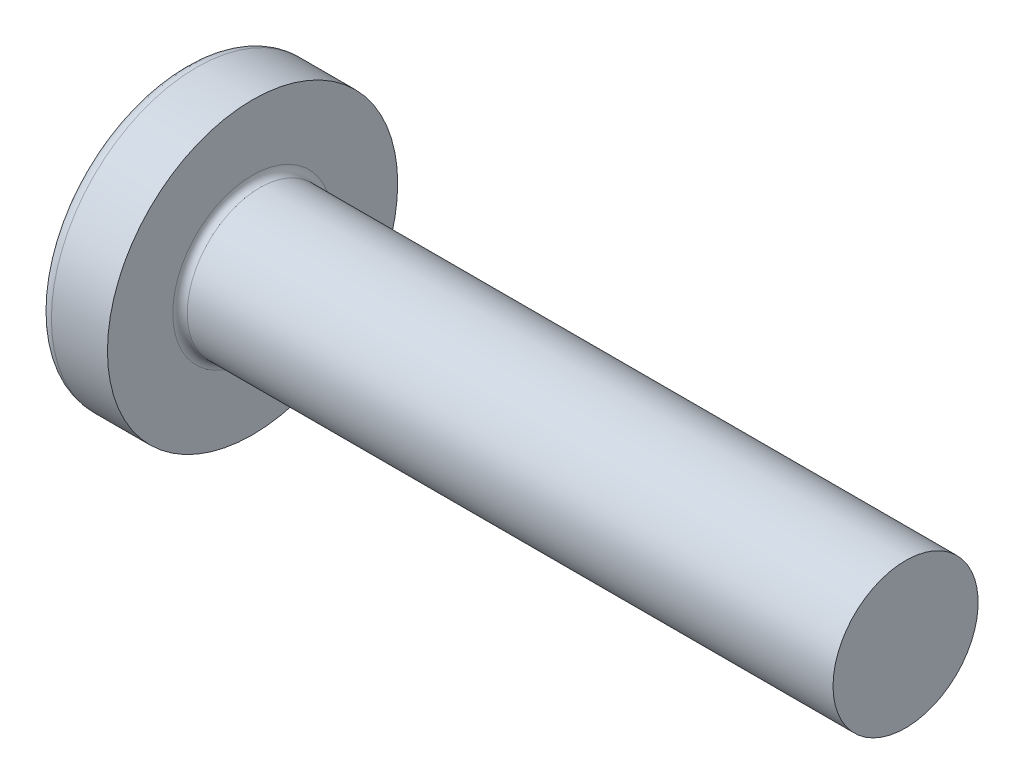
ISO-10303-21;
HEADER;
FILE_DESCRIPTION(('STEP AP214'),'2;1');
FILE_NAME('part.step','',(''),(''),'','','');
FILE_SCHEMA(('AUTOMOTIVE_DESIGN { 1 0 10303 214 1 1 1 1 }'));
ENDSEC;
DATA;
#1=APPLICATION_CONTEXT('core data for automotive mechanical design processes');
#2=APPLICATION_PROTOCOL_DEFINITION('international standard','automotive_design',2000,#1);
#3=PRODUCT_CONTEXT('',#1,'mechanical');
#4=PRODUCT('Part','Part','',(#3));
#5=PRODUCT_RELATED_PRODUCT_CATEGORY('part','',(#4));
#6=PRODUCT_DEFINITION_FORMATION('','',#4);
#7=PRODUCT_DEFINITION_CONTEXT('part definition',#1,'design');
#8=PRODUCT_DEFINITION('design','',#6,#7);
#9=PRODUCT_DEFINITION_SHAPE('','',#8);
#10=(LENGTH_UNIT() NAMED_UNIT(*) SI_UNIT(.MILLI.,.METRE.));
#11=(NAMED_UNIT(*) PLANE_ANGLE_UNIT() SI_UNIT($,.RADIAN.));
#12=(NAMED_UNIT(*) SI_UNIT($,.STERADIAN.) SOLID_ANGLE_UNIT());
#13=UNCERTAINTY_MEASURE_WITH_UNIT(LENGTH_MEASURE(1.E-05),#10,'distance_accuracy_value','');
#14=(GEOMETRIC_REPRESENTATION_CONTEXT(3) GLOBAL_UNCERTAINTY_ASSIGNED_CONTEXT((#13)) GLOBAL_UNIT_ASSIGNED_CONTEXT((#10,
#11,#12)) REPRESENTATION_CONTEXT('',''));
#15=CARTESIAN_POINT('',(0.,0.,0.));
#16=DIRECTION('',(0.,0.,1.));
#17=DIRECTION('',(1.,0.,0.));
#18=AXIS2_PLACEMENT_3D('',#15,#16,#17);
#19=CARTESIAN_POINT('',(0.,-2.15,-0.515));
#20=DIRECTION('',(0.446197753347436,-0.894934391398443,0.));
#21=DIRECTION('',(0.894934391398443,0.446197753347436,0.));
#22=AXIS2_PLACEMENT_3D('',#19,#20,#21);
#23=PLANE('',#22);
#24=DIRECTION('',(0.,0.,1.));
#25=VECTOR('',#24,1.);
#26=CARTESIAN_POINT('',(2.34,-0.983319232260743,-0.515));
#27=LINE('',#26,#25);
#28=CARTESIAN_POINT('',(2.34,-0.983319232260742,-0.515));
#29=VERTEX_POINT('',#28);
#30=CARTESIAN_POINT('',(2.34,-0.983319232260743,0.515));
#31=VERTEX_POINT('',#30);
#32=EDGE_CURVE('E150',#29,#31,#27,.T.);
#33=ORIENTED_EDGE('',*,*,#32,.F.);
#34=DIRECTION('',(0.894934391398443,0.446197753347436,0.));
#35=VECTOR('',#34,1.);
#36=CARTESIAN_POINT('',(0.331830520157853,-1.98455543332603,-0.515));
#37=LINE('',#36,#35);
#38=CARTESIAN_POINT('',(0.331830520157854,-1.98455543332603,-0.515));
#39=VERTEX_POINT('',#38);
#40=EDGE_CURVE('E154',#39,#29,#37,.T.);
#41=ORIENTED_EDGE('',*,*,#40,.F.);
#42=CARTESIAN_POINT('',(0.331830520157854,-1.98455543332603,0.514999999999998));
#43=CARTESIAN_POINT('',(0.319498798424873,-1.99070380194952,0.343333333333332));
#44=CARTESIAN_POINT('',(0.313332937558384,-1.99377798626127,0.171666666666665));
#45=CARTESIAN_POINT('',(0.313332937558389,-1.99377798626128,-0.171666666666671));
#46=CARTESIAN_POINT('',(0.319498798424884,-1.99070380194955,-0.343333333333342));
#47=CARTESIAN_POINT('',(0.331830520157871,-1.98455543332607,-0.515000000000013));
#48=B_SPLINE_CURVE_WITH_KNOTS('',3,(#42,#43,#44,#45,#46,#47),.UNSPECIFIED.,.F.,.F.,(4,2,4),(0.,
0.515414605967532,1.03082921193508),.UNSPECIFIED.);
#49=CARTESIAN_POINT('',(0.331830520157854,-1.98455543332603,0.515));
#50=VERTEX_POINT('',#49);
#51=EDGE_CURVE('E139',#50,#39,#48,.T.);
#52=ORIENTED_EDGE('',*,*,#51,.F.);
#53=DIRECTION('',(-0.894934391398443,-0.446197753347436,0.));
#54=VECTOR('',#53,1.);
#55=CARTESIAN_POINT('',(2.34,-0.983319232260743,0.515));
#56=LINE('',#55,#54);
#57=EDGE_CURVE('E164',#31,#50,#56,.T.);
#58=ORIENTED_EDGE('',*,*,#57,.F.);
#59=EDGE_LOOP('',(#33,#41,#52,#58));
#60=FACE_BOUND('',#59,.T.);
#61=ADVANCED_FACE('F17',(#60),#23,.F.);
#62=CARTESIAN_POINT('',(0.,-2.15,0.514999999999999));
#63=DIRECTION('',(0.,0.,-1.));
#64=DIRECTION('',(-1.,0.,0.));
#65=AXIS2_PLACEMENT_3D('',#62,#63,#64);
#66=PLANE('',#65);
#67=DIRECTION('',(0.,1.,0.));
#68=VECTOR('',#67,1.);
#69=CARTESIAN_POINT('',(2.34,-2.15,0.515));
#70=LINE('',#69,#68);
#71=CARTESIAN_POINT('',(2.34000000000175,-0.677477674907183,0.51499999999998));
#72=VERTEX_POINT('',#71);
#73=EDGE_CURVE('E305',#72,#31,#70,.F.);
#74=ORIENTED_EDGE('',*,*,#73,.T.);
#75=ORIENTED_EDGE('',*,*,#57,.T.);
#76=CARTESIAN_POINT('',(0.331830520157854,-1.98455543332603,0.515000000000001));
#77=CARTESIAN_POINT('',(0.273182530445949,-1.80216454181507,0.515000000000023));
#78=CARTESIAN_POINT('',(0.222773490743651,-1.61790695532938,0.515000000000022));
#79=CARTESIAN_POINT('',(0.138433311358271,-1.24565839240852,0.514999999999977));
#80=CARTESIAN_POINT('',(0.104502171675189,-1.05766741597335,0.514999999999933));
#81=CARTESIAN_POINT('',(0.0788099820017152,-0.867809744563443,0.514999999999866));
#82=B_SPLINE_CURVE_WITH_KNOTS('',3,(#76,#77,#78,#79,#80,#81),.UNSPECIFIED.,.F.,.F.,(4,2,4),(0.,
0.573085827037425,1.14617165407485),.UNSPECIFIED.);
#83=CARTESIAN_POINT('',(0.0788099820150379,-0.867809744561917,0.514999999999933));
#84=VERTEX_POINT('',#83);
#85=EDGE_CURVE('E146',#50,#84,#82,.T.);
#86=ORIENTED_EDGE('',*,*,#85,.T.);
#87=CARTESIAN_POINT('',(0.0788099820105211,-0.867809744561843,0.514999999999999));
#88=CARTESIAN_POINT('',(0.392213734002262,-0.842304642325876,0.514999999999999));
#89=CARTESIAN_POINT('',(0.70559787355606,-0.816547301111019,0.515));
#90=CARTESIAN_POINT('',(1.33229966547313,-0.76425626320608,0.515));
#91=CARTESIAN_POINT('',(1.64561731816469,-0.737722570443666,0.515));
#92=CARTESIAN_POINT('',(2.08593418824368,-0.69969155696372,0.515));
#93=CARTESIAN_POINT('',(2.21297124645575,-0.68863226058366,0.515));
#94=CARTESIAN_POINT('',(2.34000000000109,-0.677477674906791,0.515));
#95=B_SPLINE_CURVE_WITH_KNOTS('',3,(#87,#88,#89,#90,#91,#92,#93,#94),.UNSPECIFIED.,.F.,.F.,(4,2,
2,4),(0.,0.943320959581089,1.88663714759769,2.26918969179948),.UNSPECIFIED.);
#96=EDGE_CURVE('E156',#84,#72,#95,.T.);
#97=ORIENTED_EDGE('',*,*,#96,.T.);
#98=EDGE_LOOP('',(#74,#75,#86,#97));
#99=FACE_BOUND('',#98,.T.);
#100=ADVANCED_FACE('F458',(#99),#66,.T.);
#101=CARTESIAN_POINT('',(0.,2.15,-0.515));
#102=DIRECTION('',(0.,0.,1.));
#103=DIRECTION('',(1.,0.,0.));
#104=AXIS2_PLACEMENT_3D('',#101,#102,#103);
#105=PLANE('',#104);
#106=CARTESIAN_POINT('',(0.0788099820017082,-0.867809744563347,-0.515000000000002));
#107=CARTESIAN_POINT('',(0.104502171675179,-1.05766741597327,-0.515000000000001));
#108=CARTESIAN_POINT('',(0.138433311358259,-1.24565839240845,-0.515));
#109=CARTESIAN_POINT('',(0.222773490743641,-1.61790695532935,-0.515));
#110=CARTESIAN_POINT('',(0.273182530445943,-1.80216454181506,-0.514999999999999));
#111=CARTESIAN_POINT('',(0.331830520157854,-1.98455543332603,-0.514999999999999));
#112=B_SPLINE_CURVE_WITH_KNOTS('',3,(#106,#107,#108,#109,#110,#111),.UNSPECIFIED.,.F.,.F.,(4,2,
4),(0.,0.573085827037473,1.14617165407495),.UNSPECIFIED.);
#113=CARTESIAN_POINT('',(0.0788099820061147,-0.867809744562595,-0.515000000000001));
#114=VERTEX_POINT('',#113);
#115=EDGE_CURVE('E143',#114,#39,#112,.T.);
#116=ORIENTED_EDGE('',*,*,#115,.T.);
#117=ORIENTED_EDGE('',*,*,#40,.T.);
#118=DIRECTION('',(0.,1.,0.));
#119=VECTOR('',#118,1.);
#120=CARTESIAN_POINT('',(2.34,2.15,-0.515));
#121=LINE('',#120,#119);
#122=CARTESIAN_POINT('',(2.34000000000175,-0.677477674907168,-0.515));
#123=VERTEX_POINT('',#122);
#124=EDGE_CURVE('E162',#29,#123,#121,.T.);
#125=ORIENTED_EDGE('',*,*,#124,.T.);
#126=CARTESIAN_POINT('',(2.34000000000109,-0.677477674906791,-0.515));
#127=CARTESIAN_POINT('',(2.07584465982531,-0.700667758110798,-0.515));
#128=CARTESIAN_POINT('',(1.81165398196259,-0.723450497756089,-0.515));
#129=CARTESIAN_POINT('',(1.28321771173505,-0.768360358266413,-0.515));
#130=CARTESIAN_POINT('',(1.01897211955267,-0.79048748127564,-0.515));
#131=CARTESIAN_POINT('',(0.642063816057716,-0.821692201389346,-0.515));
#132=CARTESIAN_POINT('',(0.529417831854457,-0.830972904506625,-0.515));
#133=CARTESIAN_POINT('',(0.304118917866834,-0.849451547308498,-0.515));
#134=CARTESIAN_POINT('',(0.191465988073096,-0.858649486878829,-0.515));
#135=CARTESIAN_POINT('',(0.078809982010521,-0.867809744561842,-0.515));
#136=B_SPLINE_CURVE_WITH_KNOTS('',3,(#126,#127,#128,#129,#130,#131,#132,#133,#134,#135),
.UNSPECIFIED.,.F.,.F.,(4,2,2,2,4),(0.,0.795513032095966,1.59102346217911,1.93010639275618,
2.26918979140427),.UNSPECIFIED.);
#137=EDGE_CURVE('E160',#123,#114,#136,.T.);
#138=ORIENTED_EDGE('',*,*,#137,.T.);
#139=EDGE_LOOP('',(#116,#117,#125,#138));
#140=FACE_BOUND('',#139,.T.);
#141=ADVANCED_FACE('F158',(#140),#105,.T.);
#142=CARTESIAN_POINT('',(0.0788099821420474,0.,0.));
#143=DIRECTION('',(-1.,0.,0.));
#144=DIRECTION('',(0.,0.,1.));
#145=AXIS2_PLACEMENT_3D('',#142,#143,#144);
#146=CONICAL_SURFACE('',#145,1.00911780914714,0.0698131700804186);
#147=CARTESIAN_POINT('',(2.34000000000043,-0.515000000000002,0.677477674906847));
#148=CARTESIAN_POINT('',(2.07584465982464,-0.515000000000003,0.700667758110854));
#149=CARTESIAN_POINT('',(1.81165398196191,-0.515000000000003,0.723450497756147));
#150=CARTESIAN_POINT('',(1.28321771173434,-0.515000000000003,0.768360358266472));
#151=CARTESIAN_POINT('',(1.01897211955194,-0.515000000000002,0.790487481275699));
#152=CARTESIAN_POINT('',(0.642063816056353,-0.515000000000003,0.821692201389457));
#153=CARTESIAN_POINT('',(0.529417831852476,-0.515000000000003,0.830972904506786));
#154=CARTESIAN_POINT('',(0.304118917863614,-0.515000000000003,0.84945154730876));
#155=CARTESIAN_POINT('',(0.191465988069257,-0.515000000000003,0.85864948687914));
#156=CARTESIAN_POINT('',(0.0788099820060616,-0.515000000000003,0.867809744562203));
#157=B_SPLINE_CURVE_WITH_KNOTS('',3,(#147,#148,#149,#150,#151,#152,#153,#154,#155,#156),
.UNSPECIFIED.,.F.,.F.,(4,2,2,2,4),(0.,0.795513032096009,1.5910234621792,1.93010639275813,
2.26918979140808),.UNSPECIFIED.);
#158=CARTESIAN_POINT('',(2.34000000000175,-0.515000000000003,0.677477674907166));
#159=VERTEX_POINT('',#158);
#160=CARTESIAN_POINT('',(0.0788099820150116,-0.515000000000002,0.867809744611743));
#161=VERTEX_POINT('',#160);
#162=EDGE_CURVE('E289',#159,#161,#157,.T.);
#163=ORIENTED_EDGE('',*,*,#162,.F.);
#164=CARTESIAN_POINT('',(2.34000000000378,0.,0.));
#165=DIRECTION('',(-1.,0.,0.));
#166=DIRECTION('',(0.,0.,1.));
#167=AXIS2_PLACEMENT_3D('',#164,#165,#166);
#168=CIRCLE('',#167,0.850999999997271);
#169=EDGE_CURVE('E296',#72,#159,#168,.T.);
#170=ORIENTED_EDGE('',*,*,#169,.F.);
#171=ORIENTED_EDGE('',*,*,#96,.F.);
#172=CARTESIAN_POINT('',(0.0788099820283605,0.,0.));
#173=DIRECTION('',(-1.,0.,0.));
#174=DIRECTION('',(0.,0.,1.));
#175=AXIS2_PLACEMENT_3D('',#172,#173,#174);
#176=CIRCLE('',#175,1.00911780915509);
#177=EDGE_CURVE('E298',#161,#84,#176,.F.);
#178=ORIENTED_EDGE('',*,*,#177,.F.);
#179=EDGE_LOOP('',(#163,#170,#171,#178));
#180=FACE_BOUND('',#179,.T.);
#181=ADVANCED_FACE('F447',(#180),#146,.F.);
#182=CARTESIAN_POINT('',(0.0788099821420474,0.,0.));
#183=DIRECTION('',(-1.,0.,0.));
#184=DIRECTION('',(0.,0.,1.));
#185=AXIS2_PLACEMENT_3D('',#182,#183,#184);
#186=CONICAL_SURFACE('',#185,1.00911780914714,0.0698131700804186);
#187=CARTESIAN_POINT('',(0.0788099820060611,-0.514999999999996,-0.867809744562207));
#188=CARTESIAN_POINT('',(0.392213733997899,-0.514999999999996,-0.842304642326235));
#189=CARTESIAN_POINT('',(0.705597873551794,-0.514999999999997,-0.816547301111373));
#190=CARTESIAN_POINT('',(1.33229966546905,-0.514999999999997,-0.764256263206425));
#191=CARTESIAN_POINT('',(1.64561731816071,-0.514999999999997,-0.737722570444007));
#192=CARTESIAN_POINT('',(2.08593418824088,-0.514999999999997,-0.699691556963965));
#193=CARTESIAN_POINT('',(2.21297124645402,-0.514999999999997,-0.688632260583813));
#194=CARTESIAN_POINT('',(2.34000000000043,-0.514999999999998,-0.677477674906851));
#195=B_SPLINE_CURVE_WITH_KNOTS('',3,(#187,#188,#189,#190,#191,#192,#193,#194),.UNSPECIFIED.,.F.,
.F.,(4,2,2,4),(0.,0.94332095958138,1.88663714759827,2.2691896918033),.UNSPECIFIED.);
#196=CARTESIAN_POINT('',(0.0788099820172106,-0.514999999999994,-0.867809744611342));
#197=VERTEX_POINT('',#196);
#198=CARTESIAN_POINT('',(2.34000000000175,-0.514999999999998,-0.67747767490717));
#199=VERTEX_POINT('',#198);
#200=EDGE_CURVE('E283',#197,#199,#195,.T.);
#201=ORIENTED_EDGE('',*,*,#200,.F.);
#202=CARTESIAN_POINT('',(0.0788099820283605,0.,0.));
#203=DIRECTION('',(-1.,0.,0.));
#204=DIRECTION('',(0.,0.,1.));
#205=AXIS2_PLACEMENT_3D('',#202,#203,#204);
#206=CIRCLE('',#205,1.00911780915509);
#207=EDGE_CURVE('E295',#114,#197,#206,.F.);
#208=ORIENTED_EDGE('',*,*,#207,.F.);
#209=ORIENTED_EDGE('',*,*,#137,.F.);
#210=CARTESIAN_POINT('',(2.34000000000378,0.,0.));
#211=DIRECTION('',(-1.,0.,0.));
#212=DIRECTION('',(0.,0.,1.));
#213=AXIS2_PLACEMENT_3D('',#210,#211,#212);
#214=CIRCLE('',#213,0.850999999997271);
#215=EDGE_CURVE('E290',#199,#123,#214,.T.);
#216=ORIENTED_EDGE('',*,*,#215,.F.);
#217=EDGE_LOOP('',(#201,#208,#209,#216));
#218=FACE_BOUND('',#217,.T.);
#219=ADVANCED_FACE('F435',(#218),#186,.F.);
#220=CARTESIAN_POINT('',(0.,-0.514999999999992,-2.15));
#221=DIRECTION('',(0.,1.,0.));
#222=DIRECTION('',(0.,0.,1.));
#223=AXIS2_PLACEMENT_3D('',#220,#221,#222);
#224=PLANE('',#223);
#225=CARTESIAN_POINT('',(6.5,-0.515000000000002,0.));
#226=DIRECTION('',(0.,1.,0.));
#227=DIRECTION('',(0.,0.,1.));
#228=AXIS2_PLACEMENT_3D('',#225,#226,#227);
#229=CIRCLE('',#228,6.47956595768575);
#230=CARTESIAN_POINT('',(0.331830520157854,-0.515000000000004,1.98455543332603));
#231=VERTEX_POINT('',#230);
#232=EDGE_CURVE('E445',#161,#231,#229,.T.);
#233=ORIENTED_EDGE('',*,*,#232,.T.);
#234=DIRECTION('',(0.894934391398443,0.,-0.446197753347436));
#235=VECTOR('',#234,1.);
#236=CARTESIAN_POINT('',(2.34,-0.515000000000007,0.983319232260741));
#237=LINE('',#236,#235);
#238=CARTESIAN_POINT('',(2.34,-0.515000000000006,0.983319232260741));
#239=VERTEX_POINT('',#238);
#240=EDGE_CURVE('E271',#231,#239,#237,.T.);
#241=ORIENTED_EDGE('',*,*,#240,.T.);
#242=DIRECTION('',(0.,0.,1.));
#243=VECTOR('',#242,1.);
#244=CARTESIAN_POINT('',(2.34,-0.514999999999992,-2.15));
#245=LINE('',#244,#243);
#246=EDGE_CURVE('E286',#239,#159,#245,.F.);
#247=ORIENTED_EDGE('',*,*,#246,.T.);
#248=ORIENTED_EDGE('',*,*,#162,.T.);
#249=EDGE_LOOP('',(#233,#241,#247,#248));
#250=FACE_BOUND('',#249,.T.);
#251=ADVANCED_FACE('F431',(#250),#224,.T.);
#252=CARTESIAN_POINT('',(0.,-0.514999999999992,-2.15));
#253=DIRECTION('',(0.,1.,0.));
#254=DIRECTION('',(0.,0.,1.));
#255=AXIS2_PLACEMENT_3D('',#252,#253,#254);
#256=PLANE('',#255);
#257=DIRECTION('',(0.,0.,1.));
#258=VECTOR('',#257,1.);
#259=CARTESIAN_POINT('',(2.34,-0.514999999999992,-2.15));
#260=LINE('',#259,#258);
#261=CARTESIAN_POINT('',(2.34,-0.514999999999996,-0.983319232260743));
#262=VERTEX_POINT('',#261);
#263=EDGE_CURVE('E281',#199,#262,#260,.F.);
#264=ORIENTED_EDGE('',*,*,#263,.T.);
#265=DIRECTION('',(-0.894934391398443,0.,-0.446197753347436));
#266=VECTOR('',#265,1.);
#267=CARTESIAN_POINT('',(0.,-0.514999999999996,-2.15));
#268=LINE('',#267,#266);
#269=CARTESIAN_POINT('',(0.331830520157854,-0.514999999999992,-1.98455543332603));
#270=VERTEX_POINT('',#269);
#271=EDGE_CURVE('E261',#262,#270,#268,.T.);
#272=ORIENTED_EDGE('',*,*,#271,.T.);
#273=CARTESIAN_POINT('',(6.5,-0.514999999999992,0.));
#274=DIRECTION('',(0.,1.,0.));
#275=DIRECTION('',(0.,0.,1.));
#276=AXIS2_PLACEMENT_3D('',#273,#274,#275);
#277=CIRCLE('',#276,6.47956595768575);
#278=EDGE_CURVE('E708',#270,#197,#277,.T.);
#279=ORIENTED_EDGE('',*,*,#278,.T.);
#280=ORIENTED_EDGE('',*,*,#200,.T.);
#281=EDGE_LOOP('',(#264,#272,#279,#280));
#282=FACE_BOUND('',#281,.T.);
#283=ADVANCED_FACE('F426',(#282),#256,.T.);
#284=CARTESIAN_POINT('',(2.34,-0.515000000000004,0.983319232260741));
#285=DIRECTION('',(0.446197753347436,0.,0.894934391398443));
#286=DIRECTION('',(0.894934391398443,0.,-0.446197753347436));
#287=AXIS2_PLACEMENT_3D('',#284,#285,#286);
#288=PLANE('',#287);
#289=DIRECTION('',(0.,1.,0.));
#290=VECTOR('',#289,1.);
#291=CARTESIAN_POINT('',(2.34,-0.515000000000004,0.983319232260741));
#292=LINE('',#291,#290);
#293=CARTESIAN_POINT('',(2.34,0.514999999999997,0.983319232260743));
#294=VERTEX_POINT('',#293);
#295=EDGE_CURVE('E274',#239,#294,#292,.T.);
#296=ORIENTED_EDGE('',*,*,#295,.F.);
#297=ORIENTED_EDGE('',*,*,#240,.F.);
#298=CARTESIAN_POINT('',(0.331830520157854,0.514999999999994,1.98455543332603));
#299=CARTESIAN_POINT('',(0.319498798424876,0.343333333333328,1.99070380194953));
#300=CARTESIAN_POINT('',(0.313332937558386,0.171666666666661,1.99377798626128));
#301=CARTESIAN_POINT('',(0.313332937558386,-0.171666666666673,1.99377798626127));
#302=CARTESIAN_POINT('',(0.319498798424876,-0.34333333333334,1.99070380194953));
#303=CARTESIAN_POINT('',(0.331830520157854,-0.515000000000006,1.98455543332603));
#304=B_SPLINE_CURVE_WITH_KNOTS('',3,(#298,#299,#300,#301,#302,#303),.UNSPECIFIED.,.F.,.F.,(4,2,
4),(0.,0.515414605967534,1.03082921193507),.UNSPECIFIED.);
#305=CARTESIAN_POINT('',(0.331830520157854,0.514999999999988,1.98455543332604));
#306=VERTEX_POINT('',#305);
#307=EDGE_CURVE('E275',#306,#231,#304,.T.);
#308=ORIENTED_EDGE('',*,*,#307,.F.);
#309=DIRECTION('',(-0.894934391398443,0.,0.446197753347436));
#310=VECTOR('',#309,1.);
#311=CARTESIAN_POINT('',(2.34,0.514999999999997,0.983319232260744));
#312=LINE('',#311,#310);
#313=EDGE_CURVE('E255',#294,#306,#312,.T.);
#314=ORIENTED_EDGE('',*,*,#313,.F.);
#315=EDGE_LOOP('',(#296,#297,#308,#314));
#316=FACE_BOUND('',#315,.T.);
#317=ADVANCED_FACE('F423',(#316),#288,.F.);
#318=CARTESIAN_POINT('',(2.34,0.983319232260742,-0.515));
#319=DIRECTION('',(-1.,0.,0.));
#320=DIRECTION('',(0.,0.,1.));
#321=AXIS2_PLACEMENT_3D('',#318,#319,#320);
#322=PLANE('',#321);
#323=ORIENTED_EDGE('',*,*,#124,.F.);
#324=ORIENTED_EDGE('',*,*,#32,.T.);
#325=ORIENTED_EDGE('',*,*,#73,.F.);
#326=CARTESIAN_POINT('',(2.33999999999972,0.,0.));
#327=DIRECTION('',(-1.,0.,0.));
#328=DIRECTION('',(0.,0.,1.));
#329=AXIS2_PLACEMENT_3D('',#326,#327,#328);
#330=CIRCLE('',#329,0.850999999999935);
#331=EDGE_CURVE('E246',#72,#123,#330,.F.);
#332=ORIENTED_EDGE('',*,*,#331,.T.);
#333=EDGE_LOOP('',(#323,#324,#325,#332));
#334=FACE_BOUND('',#333,.T.);
#335=ADVANCED_FACE('F403',(#334),#322,.T.);
#336=CARTESIAN_POINT('',(0.,0.515000000000008,-2.15));
#337=DIRECTION('',(0.446197753347436,0.,-0.894934391398443));
#338=DIRECTION('',(-0.894934391398443,0.,-0.446197753347436));
#339=AXIS2_PLACEMENT_3D('',#336,#337,#338);
#340=PLANE('',#339);
#341=DIRECTION('',(0.,1.,0.));
#342=VECTOR('',#341,1.);
#343=CARTESIAN_POINT('',(2.34,0.983319232260742,-0.983319232260741));
#344=LINE('',#343,#342);
#345=CARTESIAN_POINT('',(2.34,0.515000000000003,-0.98331923226074));
#346=VERTEX_POINT('',#345);
#347=EDGE_CURVE('E252',#346,#262,#344,.F.);
#348=ORIENTED_EDGE('',*,*,#347,.F.);
#349=DIRECTION('',(0.894934391398443,0.,0.446197753347436));
#350=VECTOR('',#349,1.);
#351=CARTESIAN_POINT('',(0.331830520157856,0.515000000000007,-1.98455543332603));
#352=LINE('',#351,#350);
#353=CARTESIAN_POINT('',(0.331830520157855,0.51500000000001,-1.98455543332603));
#354=VERTEX_POINT('',#353);
#355=EDGE_CURVE('E236',#354,#346,#352,.T.);
#356=ORIENTED_EDGE('',*,*,#355,.F.);
#357=CARTESIAN_POINT('',(0.331830520157855,-0.514999999999994,-1.98455543332604));
#358=CARTESIAN_POINT('',(0.319498798424876,-0.343333333333327,-1.99070380194953));
#359=CARTESIAN_POINT('',(0.313332937558386,-0.17166666666666,-1.99377798626128));
#360=CARTESIAN_POINT('',(0.313332937558387,0.171666666666674,-1.99377798626127));
#361=CARTESIAN_POINT('',(0.319498798424876,0.343333333333341,-1.99070380194953));
#362=CARTESIAN_POINT('',(0.331830520157856,0.515000000000007,-1.98455543332603));
#363=B_SPLINE_CURVE_WITH_KNOTS('',3,(#357,#358,#359,#360,#361,#362),.UNSPECIFIED.,.F.,.F.,(4,2,
4),(0.,0.515414605967534,1.03082921193507),.UNSPECIFIED.);
#364=EDGE_CURVE('E264',#270,#354,#363,.T.);
#365=ORIENTED_EDGE('',*,*,#364,.F.);
#366=ORIENTED_EDGE('',*,*,#271,.F.);
#367=EDGE_LOOP('',(#348,#356,#365,#366));
#368=FACE_BOUND('',#367,.T.);
#369=ADVANCED_FACE('F398',(#368),#340,.F.);
#370=CARTESIAN_POINT('',(0.,0.514999999999993,2.15));
#371=DIRECTION('',(0.,-1.,0.));
#372=DIRECTION('',(0.,0.,-1.));
#373=AXIS2_PLACEMENT_3D('',#370,#371,#372);
#374=PLANE('',#373);
#375=DIRECTION('',(0.,0.,1.));
#376=VECTOR('',#375,1.);
#377=CARTESIAN_POINT('',(2.34,0.514999999999997,-0.515));
#378=LINE('',#377,#376);
#379=CARTESIAN_POINT('',(2.34000000000009,0.514999999999978,0.677477674907863));
#380=VERTEX_POINT('',#379);
#381=EDGE_CURVE('E249',#294,#380,#378,.F.);
#382=ORIENTED_EDGE('',*,*,#381,.F.);
#383=ORIENTED_EDGE('',*,*,#313,.T.);
#384=CARTESIAN_POINT('',(6.5,0.514999999999993,0.));
#385=DIRECTION('',(0.,1.,0.));
#386=DIRECTION('',(0.,0.,1.));
#387=AXIS2_PLACEMENT_3D('',#384,#385,#386);
#388=CIRCLE('',#387,6.47956595768575);
#389=CARTESIAN_POINT('',(0.0788099820150342,0.514999999999993,0.867809744611911));
#390=VERTEX_POINT('',#389);
#391=EDGE_CURVE('E258',#306,#390,#388,.F.);
#392=ORIENTED_EDGE('',*,*,#391,.T.);
#393=CARTESIAN_POINT('',(0.0788099820105218,0.514999999999997,0.867809744561844));
#394=CARTESIAN_POINT('',(0.392213734002263,0.514999999999997,0.842304642325877));
#395=CARTESIAN_POINT('',(0.705597873556061,0.514999999999997,0.81654730111102));
#396=CARTESIAN_POINT('',(1.33229966547313,0.514999999999997,0.764256263206081));
#397=CARTESIAN_POINT('',(1.64561731816469,0.514999999999998,0.737722570443667));
#398=CARTESIAN_POINT('',(2.08593418824345,0.514999999999998,0.699691556963741));
#399=CARTESIAN_POINT('',(2.21297124645529,0.514999999999998,0.688632260583701));
#400=CARTESIAN_POINT('',(2.3400000000004,0.514999999999998,0.677477674906854));
#401=B_SPLINE_CURVE_WITH_KNOTS('',3,(#393,#394,#395,#396,#397,#398,#399,#400),.UNSPECIFIED.,.F.,
.F.,(4,2,2,4),(0.,0.943320959581089,1.88663714759769,2.26918969179879),.UNSPECIFIED.);
#402=EDGE_CURVE('E383',#390,#380,#401,.T.);
#403=ORIENTED_EDGE('',*,*,#402,.T.);
#404=EDGE_LOOP('',(#382,#383,#392,#403));
#405=FACE_BOUND('',#404,.T.);
#406=ADVANCED_FACE('F392',(#405),#374,.T.);
#407=CARTESIAN_POINT('',(2.34,0.983319232260742,-0.515));
#408=DIRECTION('',(-1.,0.,0.));
#409=DIRECTION('',(0.,0.,1.));
#410=AXIS2_PLACEMENT_3D('',#407,#408,#409);
#411=PLANE('',#410);
#412=DIRECTION('',(0.,0.,-1.));
#413=VECTOR('',#412,1.);
#414=CARTESIAN_POINT('',(2.34,0.514999999999993,2.15));
#415=LINE('',#414,#413);
#416=CARTESIAN_POINT('',(2.34000000000175,0.514999999999983,-0.677477674907181));
#417=VERTEX_POINT('',#416);
#418=EDGE_CURVE('E243',#346,#417,#415,.F.);
#419=ORIENTED_EDGE('',*,*,#418,.F.);
#420=ORIENTED_EDGE('',*,*,#347,.T.);
#421=ORIENTED_EDGE('',*,*,#263,.F.);
#422=CARTESIAN_POINT('',(2.33999999999972,0.,0.));
#423=DIRECTION('',(-1.,0.,0.));
#424=DIRECTION('',(0.,0.,1.));
#425=AXIS2_PLACEMENT_3D('',#422,#423,#424);
#426=CIRCLE('',#425,0.850999999999935);
#427=EDGE_CURVE('E235',#199,#417,#426,.F.);
#428=ORIENTED_EDGE('',*,*,#427,.T.);
#429=EDGE_LOOP('',(#419,#420,#421,#428));
#430=FACE_BOUND('',#429,.T.);
#431=ADVANCED_FACE('F397',(#430),#411,.T.);
#432=CARTESIAN_POINT('',(2.34,0.983319232260742,-0.515));
#433=DIRECTION('',(-1.,0.,0.));
#434=DIRECTION('',(0.,0.,1.));
#435=AXIS2_PLACEMENT_3D('',#432,#433,#434);
#436=PLANE('',#435);
#437=ORIENTED_EDGE('',*,*,#246,.F.);
#438=ORIENTED_EDGE('',*,*,#295,.T.);
#439=ORIENTED_EDGE('',*,*,#381,.T.);
#440=CARTESIAN_POINT('',(2.33999999999972,0.,0.));
#441=DIRECTION('',(-1.,0.,0.));
#442=DIRECTION('',(0.,0.,1.));
#443=AXIS2_PLACEMENT_3D('',#440,#441,#442);
#444=CIRCLE('',#443,0.850999999999935);
#445=EDGE_CURVE('E231',#380,#159,#444,.F.);
#446=ORIENTED_EDGE('',*,*,#445,.T.);
#447=EDGE_LOOP('',(#437,#438,#439,#446));
#448=FACE_BOUND('',#447,.T.);
#449=ADVANCED_FACE('F615',(#448),#436,.T.);
#450=CARTESIAN_POINT('',(0.,0.514999999999993,2.15));
#451=DIRECTION('',(0.,-1.,0.));
#452=DIRECTION('',(0.,0.,-1.));
#453=AXIS2_PLACEMENT_3D('',#450,#451,#452);
#454=PLANE('',#453);
#455=CARTESIAN_POINT('',(6.5,0.515000000000003,0.));
#456=DIRECTION('',(0.,1.,0.));
#457=DIRECTION('',(0.,0.,1.));
#458=AXIS2_PLACEMENT_3D('',#455,#456,#457);
#459=CIRCLE('',#458,6.47956595768574);
#460=CARTESIAN_POINT('',(0.0788099820150344,0.515000000000003,-0.867809744611907));
#461=VERTEX_POINT('',#460);
#462=EDGE_CURVE('E240',#461,#354,#459,.F.);
#463=ORIENTED_EDGE('',*,*,#462,.T.);
#464=ORIENTED_EDGE('',*,*,#355,.T.);
#465=ORIENTED_EDGE('',*,*,#418,.T.);
#466=CARTESIAN_POINT('',(2.34000000000109,0.515000000000003,-0.677477674906789));
#467=CARTESIAN_POINT('',(2.07584465982531,0.515000000000003,-0.700667758110796));
#468=CARTESIAN_POINT('',(1.81165398196259,0.515000000000003,-0.723450497756088));
#469=CARTESIAN_POINT('',(1.28321771173505,0.515000000000003,-0.768360358266412));
#470=CARTESIAN_POINT('',(1.01897211955267,0.515000000000003,-0.790487481275638));
#471=CARTESIAN_POINT('',(0.642063816057716,0.515000000000003,-0.821692201389344));
#472=CARTESIAN_POINT('',(0.529417831854458,0.515000000000003,-0.830972904506623));
#473=CARTESIAN_POINT('',(0.304118917866835,0.515000000000003,-0.849451547308497));
#474=CARTESIAN_POINT('',(0.191465988073097,0.515000000000003,-0.858649486878827));
#475=CARTESIAN_POINT('',(0.0788099820105217,0.515000000000003,-0.86780974456184));
#476=B_SPLINE_CURVE_WITH_KNOTS('',3,(#466,#467,#468,#469,#470,#471,#472,#473,#474,#475),
.UNSPECIFIED.,.F.,.F.,(4,2,2,2,4),(0.,0.795513032095966,1.59102346217911,1.93010639275618,
2.26918979140427),.UNSPECIFIED.);
#477=EDGE_CURVE('E230',#417,#461,#476,.T.);
#478=ORIENTED_EDGE('',*,*,#477,.T.);
#479=EDGE_LOOP('',(#463,#464,#465,#478));
#480=FACE_BOUND('',#479,.T.);
#481=ADVANCED_FACE('F377',(#480),#454,.T.);
#482=CARTESIAN_POINT('',(0.0788099821420474,0.,0.));
#483=DIRECTION('',(-1.,0.,0.));
#484=DIRECTION('',(0.,0.,1.));
#485=AXIS2_PLACEMENT_3D('',#482,#483,#484);
#486=CONICAL_SURFACE('',#485,1.00911780914714,0.0698131700804186);
#487=ORIENTED_EDGE('',*,*,#402,.F.);
#488=CARTESIAN_POINT('',(0.0788099820283605,0.,0.));
#489=DIRECTION('',(-1.,0.,0.));
#490=DIRECTION('',(0.,0.,1.));
#491=AXIS2_PLACEMENT_3D('',#488,#489,#490);
#492=CIRCLE('',#491,1.00911780915509);
#493=CARTESIAN_POINT('',(0.0788099820150127,0.867809744561701,0.515));
#494=VERTEX_POINT('',#493);
#495=EDGE_CURVE('E239',#494,#390,#492,.F.);
#496=ORIENTED_EDGE('',*,*,#495,.F.);
#497=CARTESIAN_POINT('',(2.33999999999974,0.67747767490691,0.515));
#498=CARTESIAN_POINT('',(2.07584465982393,0.700667758110917,0.515));
#499=CARTESIAN_POINT('',(1.81165398196119,0.72345049775621,0.515));
#500=CARTESIAN_POINT('',(1.28321771173358,0.768360358266537,0.515));
#501=CARTESIAN_POINT('',(1.01897211955117,0.790487481275765,0.515));
#502=CARTESIAN_POINT('',(0.642063816055702,0.821692201389512,0.515));
#503=CARTESIAN_POINT('',(0.529417831851954,0.830972904506831,0.515));
#504=CARTESIAN_POINT('',(0.304118917863353,0.849451547308783,0.515));
#505=CARTESIAN_POINT('',(0.191465988069127,0.858649486879153,0.515));
#506=CARTESIAN_POINT('',(0.078809982006062,0.867809744562205,0.515));
#507=B_SPLINE_CURVE_WITH_KNOTS('',3,(#497,#498,#499,#500,#501,#502,#503,#504,#505,#506),
.UNSPECIFIED.,.F.,.F.,(4,2,2,2,4),(0.,0.795513032096054,1.59102346217929,1.93010639275782,
2.26918979140739),.UNSPECIFIED.);
#508=CARTESIAN_POINT('',(2.33999999999976,0.67747767490789,0.51499999999998));
#509=VERTEX_POINT('',#508);
#510=EDGE_CURVE('E363',#509,#494,#507,.T.);
#511=ORIENTED_EDGE('',*,*,#510,.F.);
#512=CARTESIAN_POINT('',(2.33999999999979,0.,0.));
#513=DIRECTION('',(-1.,0.,0.));
#514=DIRECTION('',(0.,0.,1.));
#515=AXIS2_PLACEMENT_3D('',#512,#513,#514);
#516=CIRCLE('',#515,0.850999999999935);
#517=EDGE_CURVE('E232',#509,#380,#516,.F.);
#518=ORIENTED_EDGE('',*,*,#517,.T.);
#519=EDGE_LOOP('',(#487,#496,#511,#518));
#520=FACE_BOUND('',#519,.T.);
#521=ADVANCED_FACE('F372',(#520),#486,.F.);
#522=CARTESIAN_POINT('',(2.34000000000001,0.,0.));
#523=DIRECTION('',(-1.,0.,0.));
#524=DIRECTION('',(0.,0.,1.));
#525=AXIS2_PLACEMENT_3D('',#522,#523,#524);
#526=CONICAL_SURFACE('',#525,0.850999999999047,1.25663706143483);
#527=CARTESIAN_POINT('',(2.61650666149399,0.,0.));
#528=VERTEX_POINT('',#527);
#529=VERTEX_LOOP('',#528);
#530=FACE_BOUND('',#529,.T.);
#531=ORIENTED_EDGE('',*,*,#169,.T.);
#532=ORIENTED_EDGE('',*,*,#445,.F.);
#533=ORIENTED_EDGE('',*,*,#517,.F.);
#534=CARTESIAN_POINT('',(2.33999999999972,0.,0.));
#535=DIRECTION('',(-1.,0.,0.));
#536=DIRECTION('',(0.,0.,1.));
#537=AXIS2_PLACEMENT_3D('',#534,#535,#536);
#538=CIRCLE('',#537,0.850999999999935);
#539=CARTESIAN_POINT('',(2.34000000000175,0.677477674907183,-0.51499999999998));
#540=VERTEX_POINT('',#539);
#541=EDGE_CURVE('E224',#540,#509,#538,.F.);
#542=ORIENTED_EDGE('',*,*,#541,.F.);
#543=CARTESIAN_POINT('',(2.34000000000378,0.,0.));
#544=DIRECTION('',(-1.,0.,0.));
#545=DIRECTION('',(0.,0.,1.));
#546=AXIS2_PLACEMENT_3D('',#543,#544,#545);
#547=CIRCLE('',#546,0.850999999997271);
#548=EDGE_CURVE('E227',#540,#417,#547,.T.);
#549=ORIENTED_EDGE('',*,*,#548,.T.);
#550=ORIENTED_EDGE('',*,*,#427,.F.);
#551=ORIENTED_EDGE('',*,*,#215,.T.);
#552=ORIENTED_EDGE('',*,*,#331,.F.);
#553=EDGE_LOOP('',(#531,#532,#533,#542,#549,#550,#551,#552));
#554=FACE_BOUND('',#553,.T.);
#555=ADVANCED_FACE('F376',(#530,#554),#526,.F.);
#556=CARTESIAN_POINT('',(0.0788099821420474,0.,0.));
#557=DIRECTION('',(-1.,0.,0.));
#558=DIRECTION('',(0.,0.,1.));
#559=AXIS2_PLACEMENT_3D('',#556,#557,#558);
#560=CONICAL_SURFACE('',#559,1.00911780914714,0.0698131700804186);
#561=ORIENTED_EDGE('',*,*,#477,.F.);
#562=ORIENTED_EDGE('',*,*,#548,.F.);
#563=CARTESIAN_POINT('',(0.078809982006062,0.867809744562205,-0.515));
#564=CARTESIAN_POINT('',(0.3922137339979,0.842304642326233,-0.515));
#565=CARTESIAN_POINT('',(0.705597873551795,0.816547301111371,-0.515));
#566=CARTESIAN_POINT('',(1.33229966546906,0.764256263206423,-0.515));
#567=CARTESIAN_POINT('',(1.64561731816071,0.737722570444005,-0.515));
#568=CARTESIAN_POINT('',(2.08593418824088,0.699691556963963,-0.515));
#569=CARTESIAN_POINT('',(2.21297124645402,0.688632260583811,-0.515));
#570=CARTESIAN_POINT('',(2.34000000000043,0.677477674906849,-0.515));
#571=B_SPLINE_CURVE_WITH_KNOTS('',3,(#563,#564,#565,#566,#567,#568,#569,#570),.UNSPECIFIED.,.F.,
.F.,(4,2,2,4),(0.,0.94332095958138,1.88663714759827,2.2691896918033),.UNSPECIFIED.);
#572=CARTESIAN_POINT('',(0.0788099820172113,0.867809744561298,-0.515));
#573=VERTEX_POINT('',#572);
#574=EDGE_CURVE('E214',#573,#540,#571,.T.);
#575=ORIENTED_EDGE('',*,*,#574,.F.);
#576=CARTESIAN_POINT('',(0.0788099820283605,0.,0.));
#577=DIRECTION('',(-1.,0.,0.));
#578=DIRECTION('',(0.,0.,1.));
#579=AXIS2_PLACEMENT_3D('',#576,#577,#578);
#580=CIRCLE('',#579,1.00911780915509);
#581=EDGE_CURVE('E370',#461,#573,#580,.F.);
#582=ORIENTED_EDGE('',*,*,#581,.F.);
#583=EDGE_LOOP('',(#561,#562,#575,#582));
#584=FACE_BOUND('',#583,.T.);
#585=ADVANCED_FACE('F339',(#584),#560,.F.);
#586=CARTESIAN_POINT('',(0.,-2.15,0.514999999999999));
#587=DIRECTION('',(0.,0.,-1.));
#588=DIRECTION('',(-1.,0.,0.));
#589=AXIS2_PLACEMENT_3D('',#586,#587,#588);
#590=PLANE('',#589);
#591=CARTESIAN_POINT('',(0.0788099820016649,0.86780974456301,0.515));
#592=CARTESIAN_POINT('',(0.104502171675132,1.05766741597299,0.515));
#593=CARTESIAN_POINT('',(0.138433311358215,1.24565839240823,0.515));
#594=CARTESIAN_POINT('',(0.222773490743613,1.61790695532924,0.515));
#595=CARTESIAN_POINT('',(0.273182530445927,1.80216454181501,0.515));
#596=CARTESIAN_POINT('',(0.331830520157858,1.98455543332603,0.515000000000001));
#597=B_SPLINE_CURVE_WITH_KNOTS('',3,(#591,#592,#593,#594,#595,#596),.UNSPECIFIED.,.F.,.F.,(4,2,
4),(0.,0.573085827037642,1.14617165407528),.UNSPECIFIED.);
#598=CARTESIAN_POINT('',(0.331830520157858,1.98455543332603,0.514999999999999));
#599=VERTEX_POINT('',#598);
#600=EDGE_CURVE('E358',#494,#599,#597,.T.);
#601=ORIENTED_EDGE('',*,*,#600,.T.);
#602=DIRECTION('',(-0.894934391398443,0.446197753347436,0.));
#603=VECTOR('',#602,1.);
#604=CARTESIAN_POINT('',(2.34,0.983319232260742,0.515));
#605=LINE('',#604,#603);
#606=CARTESIAN_POINT('',(2.34,0.983319232260743,0.515));
#607=VERTEX_POINT('',#606);
#608=EDGE_CURVE('E207',#599,#607,#605,.F.);
#609=ORIENTED_EDGE('',*,*,#608,.T.);
#610=DIRECTION('',(0.,1.,0.));
#611=VECTOR('',#610,1.);
#612=CARTESIAN_POINT('',(2.34,0.983319232260742,0.515));
#613=LINE('',#612,#611);
#614=EDGE_CURVE('E220',#509,#607,#613,.T.);
#615=ORIENTED_EDGE('',*,*,#614,.F.);
#616=ORIENTED_EDGE('',*,*,#510,.T.);
#617=EDGE_LOOP('',(#601,#609,#615,#616));
#618=FACE_BOUND('',#617,.T.);
#619=ADVANCED_FACE('F351',(#618),#590,.T.);
#620=CARTESIAN_POINT('',(2.34,0.983319232260742,-0.515));
#621=DIRECTION('',(-1.,0.,0.));
#622=DIRECTION('',(0.,0.,1.));
#623=AXIS2_PLACEMENT_3D('',#620,#621,#622);
#624=PLANE('',#623);
#625=ORIENTED_EDGE('',*,*,#614,.T.);
#626=DIRECTION('',(0.,0.,1.));
#627=VECTOR('',#626,1.);
#628=CARTESIAN_POINT('',(2.34,0.983319232260742,0.515));
#629=LINE('',#628,#627);
#630=CARTESIAN_POINT('',(2.34,0.983319232260743,-0.515));
#631=VERTEX_POINT('',#630);
#632=EDGE_CURVE('E204',#607,#631,#629,.F.);
#633=ORIENTED_EDGE('',*,*,#632,.T.);
#634=DIRECTION('',(0.,1.,0.));
#635=VECTOR('',#634,1.);
#636=CARTESIAN_POINT('',(2.34,2.15,-0.515));
#637=LINE('',#636,#635);
#638=EDGE_CURVE('E209',#540,#631,#637,.T.);
#639=ORIENTED_EDGE('',*,*,#638,.F.);
#640=ORIENTED_EDGE('',*,*,#541,.T.);
#641=EDGE_LOOP('',(#625,#633,#639,#640));
#642=FACE_BOUND('',#641,.T.);
#643=ADVANCED_FACE('F347',(#642),#624,.T.);
#644=CARTESIAN_POINT('',(0.,2.15,-0.515));
#645=DIRECTION('',(0.,0.,1.));
#646=DIRECTION('',(1.,0.,0.));
#647=AXIS2_PLACEMENT_3D('',#644,#645,#646);
#648=PLANE('',#647);
#649=ORIENTED_EDGE('',*,*,#638,.T.);
#650=DIRECTION('',(-0.894934391398443,0.446197753347436,0.));
#651=VECTOR('',#650,1.);
#652=CARTESIAN_POINT('',(2.34,0.983319232260742,-0.515));
#653=LINE('',#652,#651);
#654=CARTESIAN_POINT('',(0.331830520157857,1.98455543332603,-0.514999999999999));
#655=VERTEX_POINT('',#654);
#656=EDGE_CURVE('E200',#631,#655,#653,.T.);
#657=ORIENTED_EDGE('',*,*,#656,.T.);
#658=CARTESIAN_POINT('',(0.331830520157858,1.98455543332603,-0.514999999999999));
#659=CARTESIAN_POINT('',(0.273182530445933,1.80216454181502,-0.515000000000021));
#660=CARTESIAN_POINT('',(0.222773490743622,1.61790695532927,-0.515000000000022));
#661=CARTESIAN_POINT('',(0.138433311358227,1.2456583924083,-0.514999999999979));
#662=CARTESIAN_POINT('',(0.104502171675143,1.05766741597307,-0.514999999999935));
#663=CARTESIAN_POINT('',(0.0788099820016718,0.867809744563107,-0.51499999999987));
#664=B_SPLINE_CURVE_WITH_KNOTS('',3,(#658,#659,#660,#661,#662,#663),.UNSPECIFIED.,.F.,.F.,(4,2,
4),(0.,0.573085827037594,1.14617165407519),.UNSPECIFIED.);
#665=EDGE_CURVE('E223',#655,#573,#664,.T.);
#666=ORIENTED_EDGE('',*,*,#665,.T.);
#667=ORIENTED_EDGE('',*,*,#574,.T.);
#668=EDGE_LOOP('',(#649,#657,#666,#667));
#669=FACE_BOUND('',#668,.T.);
#670=ADVANCED_FACE('F343',(#669),#648,.T.);
#671=CARTESIAN_POINT('',(2.34,0.983319232260742,0.515));
#672=DIRECTION('',(0.446197753347436,0.894934391398443,0.));
#673=DIRECTION('',(-0.894934391398443,0.446197753347436,0.));
#674=AXIS2_PLACEMENT_3D('',#671,#672,#673);
#675=PLANE('',#674);
#676=ORIENTED_EDGE('',*,*,#632,.F.);
#677=ORIENTED_EDGE('',*,*,#608,.F.);
#678=CARTESIAN_POINT('',(0.331830520157858,1.98455543332603,-0.514999999999999));
#679=CARTESIAN_POINT('',(0.319498798424884,1.99070380194954,-0.343333333333333));
#680=CARTESIAN_POINT('',(0.313332937558398,1.9937779862613,-0.171666666666667));
#681=CARTESIAN_POINT('',(0.313332937558402,1.99377798626131,0.17166666666667));
#682=CARTESIAN_POINT('',(0.319498798424893,1.99070380194956,0.34333333333334));
#683=CARTESIAN_POINT('',(0.331830520157872,1.98455543332607,0.515000000000011));
#684=B_SPLINE_CURVE_WITH_KNOTS('',3,(#678,#679,#680,#681,#682,#683),.UNSPECIFIED.,.F.,.F.,(4,2,
4),(0.,0.515414605967532,1.03082921193508),.UNSPECIFIED.);
#685=EDGE_CURVE('E203',#655,#599,#684,.T.);
#686=ORIENTED_EDGE('',*,*,#685,.F.);
#687=ORIENTED_EDGE('',*,*,#656,.F.);
#688=EDGE_LOOP('',(#676,#677,#686,#687));
#689=FACE_BOUND('',#688,.T.);
#690=ADVANCED_FACE('F188',(#689),#675,.F.);
#691=CARTESIAN_POINT('',(6.5,0.,0.));
#692=DIRECTION('',(0.,1.,0.));
#693=DIRECTION('',(1.,0.,0.));
#694=AXIS2_PLACEMENT_3D('',#691,#692,#693);
#695=SPHERICAL_SURFACE('',#694,6.5);
#696=CARTESIAN_POINT('',(1.26538895452803,0.,0.));
#697=DIRECTION('',(-1.,0.,0.));
#698=DIRECTION('',(0.,0.,1.));
#699=AXIS2_PLACEMENT_3D('',#696,#697,#698);
#700=CIRCLE('',#699,3.85342019543974);
#701=CARTESIAN_POINT('',(1.26538895452803,0.,3.85342019543974));
#702=VERTEX_POINT('',#701);
#703=EDGE_CURVE('E322',#702,#702,#700,.F.);
#704=ORIENTED_EDGE('',*,*,#703,.F.);
#705=EDGE_LOOP('',(#704));
#706=FACE_BOUND('',#705,.T.);
#707=ORIENTED_EDGE('',*,*,#85,.F.);
#708=ORIENTED_EDGE('',*,*,#51,.T.);
#709=ORIENTED_EDGE('',*,*,#115,.F.);
#710=ORIENTED_EDGE('',*,*,#207,.T.);
#711=ORIENTED_EDGE('',*,*,#278,.F.);
#712=ORIENTED_EDGE('',*,*,#364,.T.);
#713=ORIENTED_EDGE('',*,*,#462,.F.);
#714=ORIENTED_EDGE('',*,*,#581,.T.);
#715=ORIENTED_EDGE('',*,*,#665,.F.);
#716=ORIENTED_EDGE('',*,*,#685,.T.);
#717=ORIENTED_EDGE('',*,*,#600,.F.);
#718=ORIENTED_EDGE('',*,*,#495,.T.);
#719=ORIENTED_EDGE('',*,*,#391,.F.);
#720=ORIENTED_EDGE('',*,*,#307,.T.);
#721=ORIENTED_EDGE('',*,*,#232,.F.);
#722=ORIENTED_EDGE('',*,*,#177,.T.);
#723=EDGE_LOOP('',(#707,#708,#709,#710,#711,#712,#713,#714,#715,#716,#717,#718,#719,#720,#721,#722));
#724=FACE_BOUND('',#723,.T.);
#725=ADVANCED_FACE('F141',(#706,#724),#695,.T.);
#726=CARTESIAN_POINT('',(1.55530587396956,0.,0.));
#727=DIRECTION('',(-1.,0.,0.));
#728=DIRECTION('',(0.,0.,1.));
#729=AXIS2_PLACEMENT_3D('',#726,#727,#728);
#730=TOROIDAL_SURFACE('',#729,3.64,0.36);
#731=ORIENTED_EDGE('',*,*,#703,.T.);
#732=EDGE_LOOP('',(#731));
#733=FACE_BOUND('',#732,.T.);
#734=CARTESIAN_POINT('',(1.55530587396956,0.,0.));
#735=DIRECTION('',(-1.,0.,0.));
#736=DIRECTION('',(0.,0.,1.));
#737=AXIS2_PLACEMENT_3D('',#734,#735,#736);
#738=CIRCLE('',#737,4.);
#739=CARTESIAN_POINT('',(1.55530587396956,0.,4.));
#740=VERTEX_POINT('',#739);
#741=EDGE_CURVE('E321',#740,#740,#738,.F.);
#742=ORIENTED_EDGE('',*,*,#741,.F.);
#743=EDGE_LOOP('',(#742));
#744=FACE_BOUND('',#743,.T.);
#745=ADVANCED_FACE('F187',(#733,#744),#730,.T.);
#746=CARTESIAN_POINT('',(-25.4,0.,0.));
#747=DIRECTION('',(-1.,0.,0.));
#748=DIRECTION('',(0.,0.,1.));
#749=AXIS2_PLACEMENT_3D('',#746,#747,#748);
#750=CYLINDRICAL_SURFACE('',#749,4.);
#751=ORIENTED_EDGE('',*,*,#741,.T.);
#752=EDGE_LOOP('',(#751));
#753=FACE_BOUND('',#752,.T.);
#754=CARTESIAN_POINT('',(3.1,0.,0.));
#755=DIRECTION('',(-1.,0.,0.));
#756=DIRECTION('',(0.,0.,1.));
#757=AXIS2_PLACEMENT_3D('',#754,#755,#756);
#758=CIRCLE('',#757,4.);
#759=CARTESIAN_POINT('',(3.1,0.,4.));
#760=VERTEX_POINT('',#759);
#761=EDGE_CURVE('E317',#760,#760,#758,.T.);
#762=ORIENTED_EDGE('',*,*,#761,.T.);
#763=EDGE_LOOP('',(#762));
#764=FACE_BOUND('',#763,.T.);
#765=ADVANCED_FACE('F491',(#753,#764),#750,.T.);
#766=CARTESIAN_POINT('',(3.1,2.,0.));
#767=DIRECTION('',(-1.,0.,0.));
#768=DIRECTION('',(0.,0.,1.));
#769=AXIS2_PLACEMENT_3D('',#766,#767,#768);
#770=PLANE('',#769);
#771=ORIENTED_EDGE('',*,*,#761,.F.);
#772=EDGE_LOOP('',(#771));
#773=FACE_BOUND('',#772,.T.);
#774=CARTESIAN_POINT('',(3.1,0.,0.));
#775=DIRECTION('',(1.,0.,0.));
#776=DIRECTION('',(0.,0.,1.));
#777=AXIS2_PLACEMENT_3D('',#774,#775,#776);
#778=CIRCLE('',#777,2.2);
#779=CARTESIAN_POINT('',(3.1,0.,-2.2));
#780=VERTEX_POINT('',#779);
#781=CARTESIAN_POINT('',(3.1,0.,2.2));
#782=VERTEX_POINT('',#781);
#783=EDGE_CURVE('E320',#780,#782,#778,.F.);
#784=ORIENTED_EDGE('',*,*,#783,.T.);
#785=CARTESIAN_POINT('',(3.1,0.,0.));
#786=DIRECTION('',(1.,0.,0.));
#787=DIRECTION('',(0.,0.,-1.));
#788=AXIS2_PLACEMENT_3D('',#785,#786,#787);
#789=CIRCLE('',#788,2.2);
#790=EDGE_CURVE('E37',#782,#780,#789,.F.);
#791=ORIENTED_EDGE('',*,*,#790,.T.);
#792=EDGE_LOOP('',(#784,#791));
#793=FACE_BOUND('',#792,.T.);
#794=ADVANCED_FACE('F483',(#773,#793),#770,.F.);
#795=CARTESIAN_POINT('',(21.1,2.,0.));
#796=DIRECTION('',(1.,0.,0.));
#797=DIRECTION('',(0.,0.,-1.));
#798=AXIS2_PLACEMENT_3D('',#795,#796,#797);
#799=PLANE('',#798);
#800=CARTESIAN_POINT('',(21.1,0.,0.));
#801=DIRECTION('',(-1.,0.,0.));
#802=DIRECTION('',(0.,0.,1.));
#803=AXIS2_PLACEMENT_3D('',#800,#801,#802);
#804=CIRCLE('',#803,2.);
#805=CARTESIAN_POINT('',(21.1,0.,2.));
#806=VERTEX_POINT('',#805);
#807=EDGE_CURVE('E29',#806,#806,#804,.T.);
#808=ORIENTED_EDGE('',*,*,#807,.F.);
#809=EDGE_LOOP('',(#808));
#810=FACE_BOUND('',#809,.T.);
#811=ADVANCED_FACE('F468',(#810),#799,.T.);
#812=CARTESIAN_POINT('',(3.3,0.,0.));
#813=DIRECTION('',(-1.,0.,0.));
#814=DIRECTION('',(0.,0.,1.));
#815=AXIS2_PLACEMENT_3D('',#812,#813,#814);
#816=TOROIDAL_SURFACE('',#815,2.2,0.2);
#817=ORIENTED_EDGE('',*,*,#790,.F.);
#818=ORIENTED_EDGE('',*,*,#783,.F.);
#819=EDGE_LOOP('',(#817,#818));
#820=FACE_BOUND('',#819,.T.);
#821=CARTESIAN_POINT('',(3.3,0.,0.));
#822=DIRECTION('',(-1.,0.,0.));
#823=DIRECTION('',(0.,0.,1.));
#824=AXIS2_PLACEMENT_3D('',#821,#822,#823);
#825=CIRCLE('',#824,2.);
#826=CARTESIAN_POINT('',(3.3,0.,2.));
#827=VERTEX_POINT('',#826);
#828=EDGE_CURVE('E11',#827,#827,#825,.F.);
#829=ORIENTED_EDGE('',*,*,#828,.F.);
#830=EDGE_LOOP('',(#829));
#831=FACE_BOUND('',#830,.T.);
#832=ADVANCED_FACE('F462',(#820,#831),#816,.F.);
#833=CARTESIAN_POINT('',(-25.4,0.,0.));
#834=DIRECTION('',(-1.,0.,0.));
#835=DIRECTION('',(0.,0.,1.));
#836=AXIS2_PLACEMENT_3D('',#833,#834,#835);
#837=CYLINDRICAL_SURFACE('',#836,2.);
#838=ORIENTED_EDGE('',*,*,#828,.T.);
#839=EDGE_LOOP('',(#838));
#840=FACE_BOUND('',#839,.T.);
#841=ORIENTED_EDGE('',*,*,#807,.T.);
#842=EDGE_LOOP('',(#841));
#843=FACE_BOUND('',#842,.T.);
#844=ADVANCED_FACE('F460',(#840,#843),#837,.T.);
#845=CLOSED_SHELL('',(#61,#100,#141,#181,#219,#251,#283,#317,#335,#369,#406,#431,#449,#481,#521,
#555,#585,#619,#643,#670,#690,#725,#745,#765,#794,#811,#832,#844));
#846=MANIFOLD_SOLID_BREP('B1',#845);
#847=ADVANCED_BREP_SHAPE_REPRESENTATION('',(#18,#846),#14);
#848=SHAPE_DEFINITION_REPRESENTATION(#9,#847);
ENDSEC;
END-ISO-10303-21;
